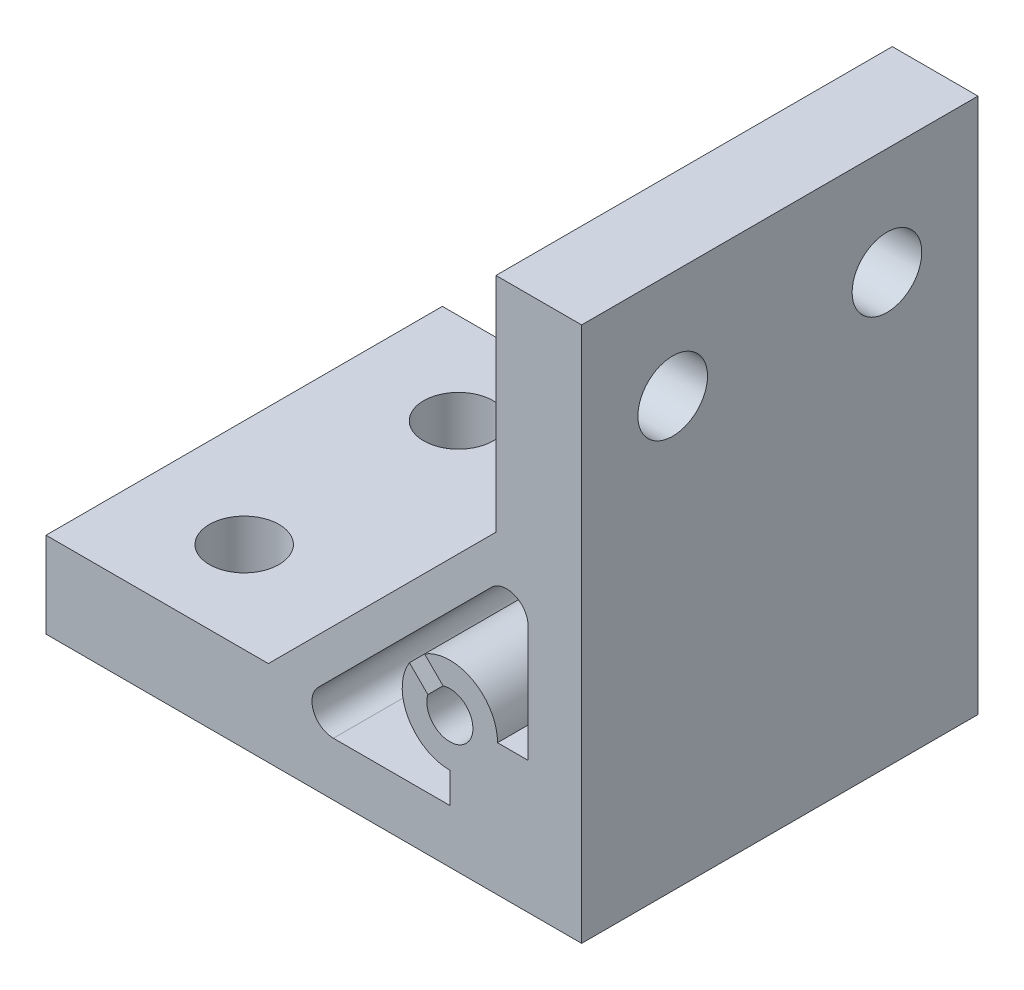
ISO-10303-21;
HEADER;
FILE_DESCRIPTION(('STEP AP214'),'2;1');
FILE_NAME('part.step','',(''),(''),'','','');
FILE_SCHEMA(('AUTOMOTIVE_DESIGN { 1 0 10303 214 1 1 1 1 }'));
ENDSEC;
DATA;
#1=APPLICATION_CONTEXT('core data for automotive mechanical design processes');
#2=APPLICATION_PROTOCOL_DEFINITION('international standard','automotive_design',2000,#1);
#3=PRODUCT_CONTEXT('',#1,'mechanical');
#4=PRODUCT('Part','Part','',(#3));
#5=PRODUCT_RELATED_PRODUCT_CATEGORY('part','',(#4));
#6=PRODUCT_DEFINITION_FORMATION('','',#4);
#7=PRODUCT_DEFINITION_CONTEXT('part definition',#1,'design');
#8=PRODUCT_DEFINITION('design','',#6,#7);
#9=PRODUCT_DEFINITION_SHAPE('','',#8);
#10=(LENGTH_UNIT() NAMED_UNIT(*) SI_UNIT(.MILLI.,.METRE.));
#11=(NAMED_UNIT(*) PLANE_ANGLE_UNIT() SI_UNIT($,.RADIAN.));
#12=(NAMED_UNIT(*) SI_UNIT($,.STERADIAN.) SOLID_ANGLE_UNIT());
#13=UNCERTAINTY_MEASURE_WITH_UNIT(LENGTH_MEASURE(1.E-05),#10,'distance_accuracy_value','');
#14=(GEOMETRIC_REPRESENTATION_CONTEXT(3) GLOBAL_UNCERTAINTY_ASSIGNED_CONTEXT((#13)) GLOBAL_UNIT_ASSIGNED_CONTEXT((#10,
#11,#12)) REPRESENTATION_CONTEXT('',''));
#15=CARTESIAN_POINT('',(0.,0.,0.));
#16=DIRECTION('',(0.,0.,1.));
#17=DIRECTION('',(1.,0.,0.));
#18=AXIS2_PLACEMENT_3D('',#15,#16,#17);
#19=CARTESIAN_POINT('',(50.,0.,18.5));
#20=DIRECTION('',(-1.,0.,0.));
#21=DIRECTION('',(0.,0.,1.));
#22=AXIS2_PLACEMENT_3D('',#19,#20,#21);
#23=PLANE('',#22);
#24=CARTESIAN_POINT('',(50.0000000000001,40.,-10.));
#25=DIRECTION('',(1.,0.,0.));
#26=DIRECTION('',(0.,0.,1.));
#27=AXIS2_PLACEMENT_3D('',#24,#25,#26);
#28=CIRCLE('',#27,3.25);
#29=CARTESIAN_POINT('',(50.0000000000001,40.,-6.75));
#30=VERTEX_POINT('',#29);
#31=EDGE_CURVE('E380',#30,#30,#28,.T.);
#32=ORIENTED_EDGE('',*,*,#31,.F.);
#33=EDGE_LOOP('',(#32));
#34=FACE_BOUND('',#33,.T.);
#35=DIRECTION('',(0.,1.,0.));
#36=VECTOR('',#35,1.);
#37=CARTESIAN_POINT('',(50.,0.,-18.5));
#38=LINE('',#37,#36);
#39=CARTESIAN_POINT('',(50.,0.,-18.5));
#40=VERTEX_POINT('',#39);
#41=CARTESIAN_POINT('',(50.,50.,-18.5));
#42=VERTEX_POINT('',#41);
#43=EDGE_CURVE('E283',#40,#42,#38,.T.);
#44=ORIENTED_EDGE('',*,*,#43,.T.);
#45=DIRECTION('',(0.,0.,-1.));
#46=VECTOR('',#45,1.);
#47=CARTESIAN_POINT('',(50.,50.,18.5));
#48=LINE('',#47,#46);
#49=CARTESIAN_POINT('',(50.,50.,18.5));
#50=VERTEX_POINT('',#49);
#51=EDGE_CURVE('E303',#50,#42,#48,.T.);
#52=ORIENTED_EDGE('',*,*,#51,.F.);
#53=DIRECTION('',(0.,1.,0.));
#54=VECTOR('',#53,1.);
#55=CARTESIAN_POINT('',(50.,0.,18.5));
#56=LINE('',#55,#54);
#57=CARTESIAN_POINT('',(50.,0.,18.5));
#58=VERTEX_POINT('',#57);
#59=EDGE_CURVE('E268',#58,#50,#56,.T.);
#60=ORIENTED_EDGE('',*,*,#59,.F.);
#61=DIRECTION('',(0.,0.,-1.));
#62=VECTOR('',#61,1.);
#63=CARTESIAN_POINT('',(50.,0.,18.5));
#64=LINE('',#63,#62);
#65=EDGE_CURVE('E43',#58,#40,#64,.T.);
#66=ORIENTED_EDGE('',*,*,#65,.T.);
#67=EDGE_LOOP('',(#44,#52,#60,#66));
#68=FACE_BOUND('',#67,.T.);
#69=CARTESIAN_POINT('',(50.0000000000001,40.,10.));
#70=DIRECTION('',(1.,0.,0.));
#71=DIRECTION('',(0.,0.,-1.));
#72=AXIS2_PLACEMENT_3D('',#69,#70,#71);
#73=CIRCLE('',#72,3.25);
#74=CARTESIAN_POINT('',(50.0000000000001,40.,6.75));
#75=VERTEX_POINT('',#74);
#76=EDGE_CURVE('E385',#75,#75,#73,.T.);
#77=ORIENTED_EDGE('',*,*,#76,.F.);
#78=EDGE_LOOP('',(#77));
#79=FACE_BOUND('',#78,.T.);
#80=ADVANCED_FACE('F35',(#34,#68,#79),#23,.F.);
#81=CARTESIAN_POINT('',(42.,29.2426406871192,18.5));
#82=DIRECTION('',(1.,0.,0.));
#83=DIRECTION('',(0.,0.,-1.));
#84=AXIS2_PLACEMENT_3D('',#81,#82,#83);
#85=PLANE('',#84);
#86=CARTESIAN_POINT('',(42.0000000000001,40.,-10.));
#87=DIRECTION('',(1.,0.,0.));
#88=DIRECTION('',(0.,0.,1.));
#89=AXIS2_PLACEMENT_3D('',#86,#87,#88);
#90=CIRCLE('',#89,3.25);
#91=CARTESIAN_POINT('',(42.0000000000001,40.,-6.75));
#92=VERTEX_POINT('',#91);
#93=EDGE_CURVE('E382',#92,#92,#90,.T.);
#94=ORIENTED_EDGE('',*,*,#93,.T.);
#95=EDGE_LOOP('',(#94));
#96=FACE_BOUND('',#95,.T.);
#97=DIRECTION('',(0.,-1.,0.));
#98=VECTOR('',#97,1.);
#99=CARTESIAN_POINT('',(42.,29.2426406871192,-18.5));
#100=LINE('',#99,#98);
#101=CARTESIAN_POINT('',(42.,50.,-18.5));
#102=VERTEX_POINT('',#101);
#103=CARTESIAN_POINT('',(42.,29.2426406871192,-18.5));
#104=VERTEX_POINT('',#103);
#105=EDGE_CURVE('E287',#102,#104,#100,.T.);
#106=ORIENTED_EDGE('',*,*,#105,.T.);
#107=DIRECTION('',(0.,0.,-1.));
#108=VECTOR('',#107,1.);
#109=CARTESIAN_POINT('',(42.,29.2426406871192,18.5));
#110=LINE('',#109,#108);
#111=CARTESIAN_POINT('',(42.,29.2426406871192,18.5));
#112=VERTEX_POINT('',#111);
#113=EDGE_CURVE('E297',#112,#104,#110,.T.);
#114=ORIENTED_EDGE('',*,*,#113,.F.);
#115=DIRECTION('',(0.,-1.,0.));
#116=VECTOR('',#115,1.);
#117=CARTESIAN_POINT('',(42.,29.2426406871192,18.5));
#118=LINE('',#117,#116);
#119=CARTESIAN_POINT('',(42.,50.,18.5));
#120=VERTEX_POINT('',#119);
#121=EDGE_CURVE('E272',#120,#112,#118,.T.);
#122=ORIENTED_EDGE('',*,*,#121,.F.);
#123=DIRECTION('',(0.,0.,-1.));
#124=VECTOR('',#123,1.);
#125=CARTESIAN_POINT('',(42.,50.,18.5));
#126=LINE('',#125,#124);
#127=EDGE_CURVE('E300',#120,#102,#126,.T.);
#128=ORIENTED_EDGE('',*,*,#127,.T.);
#129=EDGE_LOOP('',(#106,#114,#122,#128));
#130=FACE_BOUND('',#129,.T.);
#131=CARTESIAN_POINT('',(42.0000000000001,40.,10.));
#132=DIRECTION('',(1.,0.,0.));
#133=DIRECTION('',(0.,0.,-1.));
#134=AXIS2_PLACEMENT_3D('',#131,#132,#133);
#135=CIRCLE('',#134,3.25);
#136=CARTESIAN_POINT('',(42.0000000000001,40.,6.75));
#137=VERTEX_POINT('',#136);
#138=EDGE_CURVE('E388',#137,#137,#135,.T.);
#139=ORIENTED_EDGE('',*,*,#138,.T.);
#140=EDGE_LOOP('',(#139));
#141=FACE_BOUND('',#140,.T.);
#142=ADVANCED_FACE('F326',(#96,#130,#141),#85,.F.);
#143=CARTESIAN_POINT('',(0.,0.,18.5));
#144=DIRECTION('',(0.,0.,1.));
#145=DIRECTION('',(1.,0.,0.));
#146=AXIS2_PLACEMENT_3D('',#143,#144,#145);
#147=PLANE('',#146);
#148=DIRECTION('',(0.,-1.,0.));
#149=VECTOR('',#148,1.);
#150=CARTESIAN_POINT('',(0.,8.,18.5));
#151=LINE('',#150,#149);
#152=CARTESIAN_POINT('',(0.,8.,18.5));
#153=VERTEX_POINT('',#152);
#154=CARTESIAN_POINT('',(0.,0.,18.5));
#155=VERTEX_POINT('',#154);
#156=EDGE_CURVE('E262',#153,#155,#151,.T.);
#157=ORIENTED_EDGE('',*,*,#156,.T.);
#158=DIRECTION('',(1.,0.,0.));
#159=VECTOR('',#158,1.);
#160=CARTESIAN_POINT('',(0.,0.,18.5));
#161=LINE('',#160,#159);
#162=EDGE_CURVE('E265',#155,#58,#161,.T.);
#163=ORIENTED_EDGE('',*,*,#162,.T.);
#164=ORIENTED_EDGE('',*,*,#59,.T.);
#165=DIRECTION('',(-1.,0.,0.));
#166=VECTOR('',#165,1.);
#167=CARTESIAN_POINT('',(42.,50.,18.5));
#168=LINE('',#167,#166);
#169=EDGE_CURVE('E270',#50,#120,#168,.T.);
#170=ORIENTED_EDGE('',*,*,#169,.T.);
#171=ORIENTED_EDGE('',*,*,#121,.T.);
#172=DIRECTION('',(-0.707106781186546,-0.707106781186549,0.));
#173=VECTOR('',#172,1.);
#174=CARTESIAN_POINT('',(20.7573593128809,8.,18.5));
#175=LINE('',#174,#173);
#176=CARTESIAN_POINT('',(20.7573593128809,8.,18.5));
#177=VERTEX_POINT('',#176);
#178=EDGE_CURVE('E274',#112,#177,#175,.T.);
#179=ORIENTED_EDGE('',*,*,#178,.T.);
#180=DIRECTION('',(-1.,0.,0.));
#181=VECTOR('',#180,1.);
#182=CARTESIAN_POINT('',(0.,8.,18.5));
#183=LINE('',#182,#181);
#184=EDGE_CURVE('E276',#177,#153,#183,.T.);
#185=ORIENTED_EDGE('',*,*,#184,.T.);
#186=EDGE_LOOP('',(#157,#163,#164,#170,#171,#179,#185));
#187=FACE_BOUND('',#186,.T.);
#188=DIRECTION('',(0.707106781186549,-0.707106781186546,0.));
#189=VECTOR('',#188,1.);
#190=CARTESIAN_POINT('',(35.647066335444,12.9387201021829,18.5));
#191=LINE('',#190,#189);
#192=CARTESIAN_POINT('',(33.9267474297161,14.6590390079109,18.5));
#193=VERTEX_POINT('',#192);
#194=CARTESIAN_POINT('',(35.647066335444,12.9387201021829,18.5));
#195=VERTEX_POINT('',#194);
#196=EDGE_CURVE('E174',#193,#195,#191,.T.);
#197=ORIENTED_EDGE('',*,*,#196,.F.);
#198=CARTESIAN_POINT('',(37.7,12.3,18.5));
#199=DIRECTION('',(0.,0.,-1.));
#200=DIRECTION('',(1.,0.,0.));
#201=AXIS2_PLACEMENT_3D('',#198,#199,#200);
#202=CIRCLE('',#201,4.45);
#203=CARTESIAN_POINT('',(37.7,7.84999999999995,18.5));
#204=VERTEX_POINT('',#203);
#205=EDGE_CURVE('E166',#204,#193,#202,.T.);
#206=ORIENTED_EDGE('',*,*,#205,.F.);
#207=DIRECTION('',(0.,1.,0.));
#208=VECTOR('',#207,1.);
#209=CARTESIAN_POINT('',(37.7,5.,18.5));
#210=LINE('',#209,#208);
#211=CARTESIAN_POINT('',(37.7,5.,18.5));
#212=VERTEX_POINT('',#211);
#213=EDGE_CURVE('E209',#212,#204,#210,.T.);
#214=ORIENTED_EDGE('',*,*,#213,.F.);
#215=DIRECTION('',(1.,0.,0.));
#216=VECTOR('',#215,1.);
#217=CARTESIAN_POINT('',(26.828427124746,5.,18.5));
#218=LINE('',#217,#216);
#219=CARTESIAN_POINT('',(26.828427124746,4.99999999999993,18.5));
#220=VERTEX_POINT('',#219);
#221=EDGE_CURVE('E207',#220,#212,#218,.T.);
#222=ORIENTED_EDGE('',*,*,#221,.F.);
#223=CARTESIAN_POINT('',(26.8284271247464,7.00000000000011,18.5));
#224=DIRECTION('',(0.,0.,1.));
#225=DIRECTION('',(1.,0.,0.));
#226=AXIS2_PLACEMENT_3D('',#223,#224,#225);
#227=CIRCLE('',#226,2.00000000000019);
#228=CARTESIAN_POINT('',(25.4142135623729,8.41421356237311,18.5));
#229=VERTEX_POINT('',#228);
#230=EDGE_CURVE('E205',#229,#220,#227,.T.);
#231=ORIENTED_EDGE('',*,*,#230,.F.);
#232=DIRECTION('',(-0.70710678118655,-0.707106781186545,0.));
#233=VECTOR('',#232,1.);
#234=CARTESIAN_POINT('',(25.4142135623729,8.41421356237311,18.5));
#235=LINE('',#234,#233);
#236=CARTESIAN_POINT('',(41.585786437627,24.5857864376269,18.5));
#237=VERTEX_POINT('',#236);
#238=EDGE_CURVE('E203',#237,#229,#235,.T.);
#239=ORIENTED_EDGE('',*,*,#238,.F.);
#240=CARTESIAN_POINT('',(43.0000000000002,23.171572875254,18.5));
#241=DIRECTION('',(0.,0.,1.));
#242=DIRECTION('',(1.,0.,0.));
#243=AXIS2_PLACEMENT_3D('',#240,#241,#242);
#244=CIRCLE('',#243,1.99999999999993);
#245=CARTESIAN_POINT('',(45.,23.1715728752539,18.5));
#246=VERTEX_POINT('',#245);
#247=EDGE_CURVE('E201',#246,#237,#244,.T.);
#248=ORIENTED_EDGE('',*,*,#247,.F.);
#249=DIRECTION('',(0.,1.,0.));
#250=VECTOR('',#249,1.);
#251=CARTESIAN_POINT('',(45.,23.1715728752539,18.5));
#252=LINE('',#251,#250);
#253=CARTESIAN_POINT('',(45.,12.3,18.5));
#254=VERTEX_POINT('',#253);
#255=EDGE_CURVE('E199',#254,#246,#252,.T.);
#256=ORIENTED_EDGE('',*,*,#255,.F.);
#257=DIRECTION('',(1.,0.,0.));
#258=VECTOR('',#257,1.);
#259=CARTESIAN_POINT('',(42.15,12.3,18.5));
#260=LINE('',#259,#258);
#261=CARTESIAN_POINT('',(42.15,12.3,18.5));
#262=VERTEX_POINT('',#261);
#263=EDGE_CURVE('E197',#262,#254,#260,.T.);
#264=ORIENTED_EDGE('',*,*,#263,.F.);
#265=CARTESIAN_POINT('',(37.7,12.3,18.5));
#266=DIRECTION('',(0.,0.,-1.));
#267=DIRECTION('',(1.,0.,0.));
#268=AXIS2_PLACEMENT_3D('',#265,#266,#267);
#269=CIRCLE('',#268,4.45);
#270=CARTESIAN_POINT('',(35.3409609920885,16.0732525702836,18.5));
#271=VERTEX_POINT('',#270);
#272=EDGE_CURVE('E195',#271,#262,#269,.T.);
#273=ORIENTED_EDGE('',*,*,#272,.F.);
#274=DIRECTION('',(-0.707106781186684,0.707106781186411,0.));
#275=VECTOR('',#274,1.);
#276=CARTESIAN_POINT('',(37.0612798978168,14.3529336645559,18.5));
#277=LINE('',#276,#275);
#278=CARTESIAN_POINT('',(37.0612798978168,14.3529336645559,18.5));
#279=VERTEX_POINT('',#278);
#280=EDGE_CURVE('E190',#279,#271,#277,.T.);
#281=ORIENTED_EDGE('',*,*,#280,.F.);
#282=CARTESIAN_POINT('',(37.7,12.3,18.5));
#283=DIRECTION('',(0.,0.,1.));
#284=DIRECTION('',(1.,0.,0.));
#285=AXIS2_PLACEMENT_3D('',#282,#283,#284);
#286=CIRCLE('',#285,2.15);
#287=EDGE_CURVE('E188',#195,#279,#286,.T.);
#288=ORIENTED_EDGE('',*,*,#287,.F.);
#289=EDGE_LOOP('',(#197,#206,#214,#222,#231,#239,#248,#256,#264,#273,#281,#288));
#290=FACE_BOUND('',#289,.T.);
#291=ADVANCED_FACE('F186',(#187,#290),#147,.T.);
#292=CARTESIAN_POINT('',(0.,0.,-18.5));
#293=DIRECTION('',(0.,0.,1.));
#294=DIRECTION('',(1.,0.,0.));
#295=AXIS2_PLACEMENT_3D('',#292,#293,#294);
#296=PLANE('',#295);
#297=DIRECTION('',(0.,-1.,0.));
#298=VECTOR('',#297,1.);
#299=CARTESIAN_POINT('',(0.,8.,-18.5));
#300=LINE('',#299,#298);
#301=CARTESIAN_POINT('',(0.,8.,-18.5));
#302=VERTEX_POINT('',#301);
#303=CARTESIAN_POINT('',(0.,0.,-18.5));
#304=VERTEX_POINT('',#303);
#305=EDGE_CURVE('E182',#302,#304,#300,.T.);
#306=ORIENTED_EDGE('',*,*,#305,.F.);
#307=DIRECTION('',(-1.,0.,0.));
#308=VECTOR('',#307,1.);
#309=CARTESIAN_POINT('',(0.,8.,-18.5));
#310=LINE('',#309,#308);
#311=CARTESIAN_POINT('',(20.7573593128809,8.,-18.5));
#312=VERTEX_POINT('',#311);
#313=EDGE_CURVE('E266',#312,#302,#310,.T.);
#314=ORIENTED_EDGE('',*,*,#313,.F.);
#315=DIRECTION('',(-0.707106781186546,-0.707106781186549,0.));
#316=VECTOR('',#315,1.);
#317=CARTESIAN_POINT('',(20.7573593128809,8.,-18.5));
#318=LINE('',#317,#316);
#319=EDGE_CURVE('E289',#104,#312,#318,.T.);
#320=ORIENTED_EDGE('',*,*,#319,.F.);
#321=ORIENTED_EDGE('',*,*,#105,.F.);
#322=DIRECTION('',(-1.,0.,0.));
#323=VECTOR('',#322,1.);
#324=CARTESIAN_POINT('',(42.,50.,-18.5));
#325=LINE('',#324,#323);
#326=EDGE_CURVE('E285',#42,#102,#325,.T.);
#327=ORIENTED_EDGE('',*,*,#326,.F.);
#328=ORIENTED_EDGE('',*,*,#43,.F.);
#329=DIRECTION('',(1.,0.,0.));
#330=VECTOR('',#329,1.);
#331=CARTESIAN_POINT('',(0.,0.,-18.5));
#332=LINE('',#331,#330);
#333=EDGE_CURVE('E281',#304,#40,#332,.T.);
#334=ORIENTED_EDGE('',*,*,#333,.F.);
#335=EDGE_LOOP('',(#306,#314,#320,#321,#327,#328,#334));
#336=FACE_BOUND('',#335,.T.);
#337=CARTESIAN_POINT('',(37.7,12.3,-18.5));
#338=DIRECTION('',(0.,0.,-1.));
#339=DIRECTION('',(1.,0.,0.));
#340=AXIS2_PLACEMENT_3D('',#337,#338,#339);
#341=CIRCLE('',#340,4.45);
#342=CARTESIAN_POINT('',(37.7,7.84999999999995,-18.5));
#343=VERTEX_POINT('',#342);
#344=CARTESIAN_POINT('',(33.9267474297161,14.6590390079109,-18.5));
#345=VERTEX_POINT('',#344);
#346=EDGE_CURVE('E58',#343,#345,#341,.T.);
#347=ORIENTED_EDGE('',*,*,#346,.T.);
#348=DIRECTION('',(0.707106781186549,-0.707106781186546,0.));
#349=VECTOR('',#348,1.);
#350=CARTESIAN_POINT('',(35.647066335444,12.9387201021829,-18.5));
#351=LINE('',#350,#349);
#352=CARTESIAN_POINT('',(35.647066335444,12.9387201021829,-18.5));
#353=VERTEX_POINT('',#352);
#354=EDGE_CURVE('E181',#345,#353,#351,.T.);
#355=ORIENTED_EDGE('',*,*,#354,.T.);
#356=CARTESIAN_POINT('',(37.7,12.3,-18.5));
#357=DIRECTION('',(0.,0.,1.));
#358=DIRECTION('',(1.,0.,0.));
#359=AXIS2_PLACEMENT_3D('',#356,#357,#358);
#360=CIRCLE('',#359,2.15);
#361=CARTESIAN_POINT('',(37.0612798978168,14.3529336645559,-18.5));
#362=VERTEX_POINT('',#361);
#363=EDGE_CURVE('E214',#353,#362,#360,.T.);
#364=ORIENTED_EDGE('',*,*,#363,.T.);
#365=DIRECTION('',(-0.707106781186684,0.707106781186411,0.));
#366=VECTOR('',#365,1.);
#367=CARTESIAN_POINT('',(37.0612798978168,14.3529336645559,-18.5));
#368=LINE('',#367,#366);
#369=CARTESIAN_POINT('',(35.3409609920885,16.0732525702836,-18.5));
#370=VERTEX_POINT('',#369);
#371=EDGE_CURVE('E217',#362,#370,#368,.T.);
#372=ORIENTED_EDGE('',*,*,#371,.T.);
#373=CARTESIAN_POINT('',(37.7,12.3,-18.5));
#374=DIRECTION('',(0.,0.,-1.));
#375=DIRECTION('',(1.,0.,0.));
#376=AXIS2_PLACEMENT_3D('',#373,#374,#375);
#377=CIRCLE('',#376,4.45);
#378=CARTESIAN_POINT('',(42.15,12.3,-18.5));
#379=VERTEX_POINT('',#378);
#380=EDGE_CURVE('E220',#370,#379,#377,.T.);
#381=ORIENTED_EDGE('',*,*,#380,.T.);
#382=DIRECTION('',(1.,0.,0.));
#383=VECTOR('',#382,1.);
#384=CARTESIAN_POINT('',(42.15,12.3,-18.5));
#385=LINE('',#384,#383);
#386=CARTESIAN_POINT('',(45.,12.3,-18.5));
#387=VERTEX_POINT('',#386);
#388=EDGE_CURVE('E223',#379,#387,#385,.T.);
#389=ORIENTED_EDGE('',*,*,#388,.T.);
#390=DIRECTION('',(0.,1.,0.));
#391=VECTOR('',#390,1.);
#392=CARTESIAN_POINT('',(45.,23.1715728752539,-18.5));
#393=LINE('',#392,#391);
#394=CARTESIAN_POINT('',(45.,23.1715728752539,-18.5));
#395=VERTEX_POINT('',#394);
#396=EDGE_CURVE('E226',#387,#395,#393,.T.);
#397=ORIENTED_EDGE('',*,*,#396,.T.);
#398=CARTESIAN_POINT('',(43.0000000000002,23.171572875254,-18.5));
#399=DIRECTION('',(0.,0.,1.));
#400=DIRECTION('',(1.,0.,0.));
#401=AXIS2_PLACEMENT_3D('',#398,#399,#400);
#402=CIRCLE('',#401,1.99999999999993);
#403=CARTESIAN_POINT('',(41.585786437627,24.5857864376269,-18.5));
#404=VERTEX_POINT('',#403);
#405=EDGE_CURVE('E229',#395,#404,#402,.T.);
#406=ORIENTED_EDGE('',*,*,#405,.T.);
#407=DIRECTION('',(-0.70710678118655,-0.707106781186545,0.));
#408=VECTOR('',#407,1.);
#409=CARTESIAN_POINT('',(25.4142135623729,8.41421356237311,-18.5));
#410=LINE('',#409,#408);
#411=CARTESIAN_POINT('',(25.4142135623729,8.41421356237311,-18.5));
#412=VERTEX_POINT('',#411);
#413=EDGE_CURVE('E232',#404,#412,#410,.T.);
#414=ORIENTED_EDGE('',*,*,#413,.T.);
#415=CARTESIAN_POINT('',(26.8284271247464,7.00000000000011,-18.5));
#416=DIRECTION('',(0.,0.,1.));
#417=DIRECTION('',(1.,0.,0.));
#418=AXIS2_PLACEMENT_3D('',#415,#416,#417);
#419=CIRCLE('',#418,2.00000000000019);
#420=CARTESIAN_POINT('',(26.828427124746,4.99999999999993,-18.5));
#421=VERTEX_POINT('',#420);
#422=EDGE_CURVE('E235',#412,#421,#419,.T.);
#423=ORIENTED_EDGE('',*,*,#422,.T.);
#424=DIRECTION('',(1.,0.,0.));
#425=VECTOR('',#424,1.);
#426=CARTESIAN_POINT('',(26.828427124746,5.,-18.5));
#427=LINE('',#426,#425);
#428=CARTESIAN_POINT('',(37.7,5.,-18.5));
#429=VERTEX_POINT('',#428);
#430=EDGE_CURVE('E238',#421,#429,#427,.T.);
#431=ORIENTED_EDGE('',*,*,#430,.T.);
#432=DIRECTION('',(0.,1.,0.));
#433=VECTOR('',#432,1.);
#434=CARTESIAN_POINT('',(37.7,5.,-18.5));
#435=LINE('',#434,#433);
#436=EDGE_CURVE('E175',#429,#343,#435,.T.);
#437=ORIENTED_EDGE('',*,*,#436,.T.);
#438=EDGE_LOOP('',(#347,#355,#364,#372,#381,#389,#397,#406,#414,#423,#431,#437));
#439=FACE_BOUND('',#438,.T.);
#440=ADVANCED_FACE('F316',(#336,#439),#296,.F.);
#441=CARTESIAN_POINT('',(0.,8.,18.5));
#442=DIRECTION('',(1.,0.,0.));
#443=DIRECTION('',(0.,0.,-1.));
#444=AXIS2_PLACEMENT_3D('',#441,#442,#443);
#445=PLANE('',#444);
#446=ORIENTED_EDGE('',*,*,#305,.T.);
#447=DIRECTION('',(0.,0.,-1.));
#448=VECTOR('',#447,1.);
#449=CARTESIAN_POINT('',(0.,0.,18.5));
#450=LINE('',#449,#448);
#451=EDGE_CURVE('E11',#155,#304,#450,.T.);
#452=ORIENTED_EDGE('',*,*,#451,.F.);
#453=ORIENTED_EDGE('',*,*,#156,.F.);
#454=DIRECTION('',(0.,0.,-1.));
#455=VECTOR('',#454,1.);
#456=CARTESIAN_POINT('',(0.,8.,18.5));
#457=LINE('',#456,#455);
#458=EDGE_CURVE('E278',#153,#302,#457,.T.);
#459=ORIENTED_EDGE('',*,*,#458,.T.);
#460=EDGE_LOOP('',(#446,#452,#453,#459));
#461=FACE_BOUND('',#460,.T.);
#462=ADVANCED_FACE('F37',(#461),#445,.F.);
#463=CARTESIAN_POINT('',(0.,0.,18.5));
#464=DIRECTION('',(0.,1.,0.));
#465=DIRECTION('',(0.,0.,1.));
#466=AXIS2_PLACEMENT_3D('',#463,#464,#465);
#467=PLANE('',#466);
#468=CARTESIAN_POINT('',(10.,0.,10.));
#469=DIRECTION('',(0.,1.,0.));
#470=DIRECTION('',(0.,0.,-1.));
#471=AXIS2_PLACEMENT_3D('',#468,#469,#470);
#472=CIRCLE('',#471,3.25);
#473=CARTESIAN_POINT('',(10.,0.,6.75));
#474=VERTEX_POINT('',#473);
#475=EDGE_CURVE('E369',#474,#474,#472,.T.);
#476=ORIENTED_EDGE('',*,*,#475,.T.);
#477=EDGE_LOOP('',(#476));
#478=FACE_BOUND('',#477,.T.);
#479=CARTESIAN_POINT('',(10.,0.,-10.));
#480=DIRECTION('',(0.,1.,0.));
#481=DIRECTION('',(0.,0.,1.));
#482=AXIS2_PLACEMENT_3D('',#479,#480,#481);
#483=CIRCLE('',#482,3.25);
#484=CARTESIAN_POINT('',(10.,0.,-6.75));
#485=VERTEX_POINT('',#484);
#486=EDGE_CURVE('E212',#485,#485,#483,.T.);
#487=ORIENTED_EDGE('',*,*,#486,.T.);
#488=EDGE_LOOP('',(#487));
#489=FACE_BOUND('',#488,.T.);
#490=ORIENTED_EDGE('',*,*,#333,.T.);
#491=ORIENTED_EDGE('',*,*,#65,.F.);
#492=ORIENTED_EDGE('',*,*,#162,.F.);
#493=ORIENTED_EDGE('',*,*,#451,.T.);
#494=EDGE_LOOP('',(#490,#491,#492,#493));
#495=FACE_BOUND('',#494,.T.);
#496=ADVANCED_FACE('F334',(#478,#489,#495),#467,.F.);
#497=CARTESIAN_POINT('',(42.,50.,18.5));
#498=DIRECTION('',(0.,-1.,0.));
#499=DIRECTION('',(0.,0.,-1.));
#500=AXIS2_PLACEMENT_3D('',#497,#498,#499);
#501=PLANE('',#500);
#502=ORIENTED_EDGE('',*,*,#326,.T.);
#503=ORIENTED_EDGE('',*,*,#127,.F.);
#504=ORIENTED_EDGE('',*,*,#169,.F.);
#505=ORIENTED_EDGE('',*,*,#51,.T.);
#506=EDGE_LOOP('',(#502,#503,#504,#505));
#507=FACE_BOUND('',#506,.T.);
#508=ADVANCED_FACE('F322',(#507),#501,.F.);
#509=CARTESIAN_POINT('',(20.7573593128809,8.,18.5));
#510=DIRECTION('',(0.707106781186549,-0.707106781186546,0.));
#511=DIRECTION('',(0.707106781186546,0.707106781186549,0.));
#512=AXIS2_PLACEMENT_3D('',#509,#510,#511);
#513=PLANE('',#512);
#514=ORIENTED_EDGE('',*,*,#319,.T.);
#515=DIRECTION('',(0.,0.,-1.));
#516=VECTOR('',#515,1.);
#517=CARTESIAN_POINT('',(20.7573593128809,8.,18.5));
#518=LINE('',#517,#516);
#519=EDGE_CURVE('E294',#177,#312,#518,.T.);
#520=ORIENTED_EDGE('',*,*,#519,.F.);
#521=ORIENTED_EDGE('',*,*,#178,.F.);
#522=ORIENTED_EDGE('',*,*,#113,.T.);
#523=EDGE_LOOP('',(#514,#520,#521,#522));
#524=FACE_BOUND('',#523,.T.);
#525=ADVANCED_FACE('F342',(#524),#513,.F.);
#526=CARTESIAN_POINT('',(0.,8.,18.5));
#527=DIRECTION('',(0.,-1.,0.));
#528=DIRECTION('',(0.,0.,-1.));
#529=AXIS2_PLACEMENT_3D('',#526,#527,#528);
#530=PLANE('',#529);
#531=CARTESIAN_POINT('',(10.,8.,10.));
#532=DIRECTION('',(0.,1.,0.));
#533=DIRECTION('',(0.,0.,-1.));
#534=AXIS2_PLACEMENT_3D('',#531,#532,#533);
#535=CIRCLE('',#534,3.25);
#536=CARTESIAN_POINT('',(10.,8.,6.75));
#537=VERTEX_POINT('',#536);
#538=EDGE_CURVE('E377',#537,#537,#535,.T.);
#539=ORIENTED_EDGE('',*,*,#538,.F.);
#540=EDGE_LOOP('',(#539));
#541=FACE_BOUND('',#540,.T.);
#542=CARTESIAN_POINT('',(10.,8.,-10.));
#543=DIRECTION('',(0.,1.,0.));
#544=DIRECTION('',(0.,0.,1.));
#545=AXIS2_PLACEMENT_3D('',#542,#543,#544);
#546=CIRCLE('',#545,3.25);
#547=CARTESIAN_POINT('',(10.,8.,-6.75));
#548=VERTEX_POINT('',#547);
#549=EDGE_CURVE('E373',#548,#548,#546,.T.);
#550=ORIENTED_EDGE('',*,*,#549,.F.);
#551=EDGE_LOOP('',(#550));
#552=FACE_BOUND('',#551,.T.);
#553=ORIENTED_EDGE('',*,*,#313,.T.);
#554=ORIENTED_EDGE('',*,*,#458,.F.);
#555=ORIENTED_EDGE('',*,*,#184,.F.);
#556=ORIENTED_EDGE('',*,*,#519,.T.);
#557=EDGE_LOOP('',(#553,#554,#555,#556));
#558=FACE_BOUND('',#557,.T.);
#559=ADVANCED_FACE('F339',(#541,#552,#558),#530,.F.);
#560=CARTESIAN_POINT('',(37.7,12.3,18.5));
#561=DIRECTION('',(0.,0.,-1.));
#562=DIRECTION('',(-1.,0.,0.));
#563=AXIS2_PLACEMENT_3D('',#560,#561,#562);
#564=CYLINDRICAL_SURFACE('',#563,4.45);
#565=ORIENTED_EDGE('',*,*,#346,.F.);
#566=DIRECTION('',(0.,0.,-1.));
#567=VECTOR('',#566,1.);
#568=CARTESIAN_POINT('',(37.7,7.84999999999995,18.5));
#569=LINE('',#568,#567);
#570=EDGE_CURVE('E170',#204,#343,#569,.T.);
#571=ORIENTED_EDGE('',*,*,#570,.F.);
#572=ORIENTED_EDGE('',*,*,#205,.T.);
#573=DIRECTION('',(0.,0.,-1.));
#574=VECTOR('',#573,1.);
#575=CARTESIAN_POINT('',(33.9267474297161,14.6590390079109,18.5));
#576=LINE('',#575,#574);
#577=EDGE_CURVE('E169',#193,#345,#576,.T.);
#578=ORIENTED_EDGE('',*,*,#577,.T.);
#579=EDGE_LOOP('',(#565,#571,#572,#578));
#580=FACE_BOUND('',#579,.T.);
#581=ADVANCED_FACE('F168',(#580),#564,.T.);
#582=CARTESIAN_POINT('',(35.647066335444,12.9387201021829,18.5));
#583=DIRECTION('',(0.707106781186546,0.707106781186549,0.));
#584=DIRECTION('',(-0.707106781186549,0.707106781186546,0.));
#585=AXIS2_PLACEMENT_3D('',#582,#583,#584);
#586=PLANE('',#585);
#587=ORIENTED_EDGE('',*,*,#354,.F.);
#588=ORIENTED_EDGE('',*,*,#577,.F.);
#589=ORIENTED_EDGE('',*,*,#196,.T.);
#590=DIRECTION('',(0.,0.,-1.));
#591=VECTOR('',#590,1.);
#592=CARTESIAN_POINT('',(35.647066335444,12.9387201021829,18.5));
#593=LINE('',#592,#591);
#594=EDGE_CURVE('E183',#195,#353,#593,.T.);
#595=ORIENTED_EDGE('',*,*,#594,.T.);
#596=EDGE_LOOP('',(#587,#588,#589,#595));
#597=FACE_BOUND('',#596,.T.);
#598=ADVANCED_FACE('F178',(#597),#586,.T.);
#599=CARTESIAN_POINT('',(37.7,12.3,18.5));
#600=DIRECTION('',(0.,0.,-1.));
#601=DIRECTION('',(-1.,0.,0.));
#602=AXIS2_PLACEMENT_3D('',#599,#600,#601);
#603=CYLINDRICAL_SURFACE('',#602,2.15);
#604=ORIENTED_EDGE('',*,*,#363,.F.);
#605=ORIENTED_EDGE('',*,*,#594,.F.);
#606=ORIENTED_EDGE('',*,*,#287,.T.);
#607=DIRECTION('',(0.,0.,-1.));
#608=VECTOR('',#607,1.);
#609=CARTESIAN_POINT('',(37.0612798978168,14.3529336645559,18.5));
#610=LINE('',#609,#608);
#611=EDGE_CURVE('E259',#279,#362,#610,.T.);
#612=ORIENTED_EDGE('',*,*,#611,.T.);
#613=EDGE_LOOP('',(#604,#605,#606,#612));
#614=FACE_BOUND('',#613,.T.);
#615=ADVANCED_FACE('F447',(#614),#603,.F.);
#616=CARTESIAN_POINT('',(37.0612798978168,14.3529336645559,18.5));
#617=DIRECTION('',(-0.707106781186411,-0.707106781186684,0.));
#618=DIRECTION('',(0.707106781186684,-0.707106781186411,0.));
#619=AXIS2_PLACEMENT_3D('',#616,#617,#618);
#620=PLANE('',#619);
#621=ORIENTED_EDGE('',*,*,#371,.F.);
#622=ORIENTED_EDGE('',*,*,#611,.F.);
#623=ORIENTED_EDGE('',*,*,#280,.T.);
#624=DIRECTION('',(0.,0.,-1.));
#625=VECTOR('',#624,1.);
#626=CARTESIAN_POINT('',(35.3409609920885,16.0732525702836,18.5));
#627=LINE('',#626,#625);
#628=EDGE_CURVE('E257',#271,#370,#627,.T.);
#629=ORIENTED_EDGE('',*,*,#628,.T.);
#630=EDGE_LOOP('',(#621,#622,#623,#629));
#631=FACE_BOUND('',#630,.T.);
#632=ADVANCED_FACE('F443',(#631),#620,.T.);
#633=CARTESIAN_POINT('',(37.7,12.3,18.5));
#634=DIRECTION('',(0.,0.,-1.));
#635=DIRECTION('',(-1.,0.,0.));
#636=AXIS2_PLACEMENT_3D('',#633,#634,#635);
#637=CYLINDRICAL_SURFACE('',#636,4.45);
#638=ORIENTED_EDGE('',*,*,#380,.F.);
#639=ORIENTED_EDGE('',*,*,#628,.F.);
#640=ORIENTED_EDGE('',*,*,#272,.T.);
#641=DIRECTION('',(0.,0.,-1.));
#642=VECTOR('',#641,1.);
#643=CARTESIAN_POINT('',(42.15,12.3,18.5));
#644=LINE('',#643,#642);
#645=EDGE_CURVE('E255',#262,#379,#644,.T.);
#646=ORIENTED_EDGE('',*,*,#645,.T.);
#647=EDGE_LOOP('',(#638,#639,#640,#646));
#648=FACE_BOUND('',#647,.T.);
#649=ADVANCED_FACE('F439',(#648),#637,.T.);
#650=CARTESIAN_POINT('',(42.15,12.3,18.5));
#651=DIRECTION('',(0.,1.,0.));
#652=DIRECTION('',(0.,0.,1.));
#653=AXIS2_PLACEMENT_3D('',#650,#651,#652);
#654=PLANE('',#653);
#655=ORIENTED_EDGE('',*,*,#388,.F.);
#656=ORIENTED_EDGE('',*,*,#645,.F.);
#657=ORIENTED_EDGE('',*,*,#263,.T.);
#658=DIRECTION('',(0.,0.,-1.));
#659=VECTOR('',#658,1.);
#660=CARTESIAN_POINT('',(45.,12.3,18.5));
#661=LINE('',#660,#659);
#662=EDGE_CURVE('E253',#254,#387,#661,.T.);
#663=ORIENTED_EDGE('',*,*,#662,.T.);
#664=EDGE_LOOP('',(#655,#656,#657,#663));
#665=FACE_BOUND('',#664,.T.);
#666=ADVANCED_FACE('F435',(#665),#654,.T.);
#667=CARTESIAN_POINT('',(45.,23.1715728752539,18.5));
#668=DIRECTION('',(-1.,0.,0.));
#669=DIRECTION('',(0.,0.,1.));
#670=AXIS2_PLACEMENT_3D('',#667,#668,#669);
#671=PLANE('',#670);
#672=ORIENTED_EDGE('',*,*,#396,.F.);
#673=ORIENTED_EDGE('',*,*,#662,.F.);
#674=ORIENTED_EDGE('',*,*,#255,.T.);
#675=DIRECTION('',(0.,0.,-1.));
#676=VECTOR('',#675,1.);
#677=CARTESIAN_POINT('',(45.,23.1715728752539,18.5));
#678=LINE('',#677,#676);
#679=EDGE_CURVE('E251',#246,#395,#678,.T.);
#680=ORIENTED_EDGE('',*,*,#679,.T.);
#681=EDGE_LOOP('',(#672,#673,#674,#680));
#682=FACE_BOUND('',#681,.T.);
#683=ADVANCED_FACE('F431',(#682),#671,.T.);
#684=CARTESIAN_POINT('',(43.0000000000002,23.171572875254,18.5));
#685=DIRECTION('',(0.,0.,-1.));
#686=DIRECTION('',(-1.,0.,0.));
#687=AXIS2_PLACEMENT_3D('',#684,#685,#686);
#688=CYLINDRICAL_SURFACE('',#687,1.99999999999993);
#689=ORIENTED_EDGE('',*,*,#405,.F.);
#690=ORIENTED_EDGE('',*,*,#679,.F.);
#691=ORIENTED_EDGE('',*,*,#247,.T.);
#692=DIRECTION('',(0.,0.,-1.));
#693=VECTOR('',#692,1.);
#694=CARTESIAN_POINT('',(41.585786437627,24.5857864376269,18.5));
#695=LINE('',#694,#693);
#696=EDGE_CURVE('E249',#237,#404,#695,.T.);
#697=ORIENTED_EDGE('',*,*,#696,.T.);
#698=EDGE_LOOP('',(#689,#690,#691,#697));
#699=FACE_BOUND('',#698,.T.);
#700=ADVANCED_FACE('F427',(#699),#688,.F.);
#701=CARTESIAN_POINT('',(25.4142135623729,8.41421356237311,18.5));
#702=DIRECTION('',(0.707106781186545,-0.70710678118655,0.));
#703=DIRECTION('',(0.70710678118655,0.707106781186545,0.));
#704=AXIS2_PLACEMENT_3D('',#701,#702,#703);
#705=PLANE('',#704);
#706=ORIENTED_EDGE('',*,*,#413,.F.);
#707=ORIENTED_EDGE('',*,*,#696,.F.);
#708=ORIENTED_EDGE('',*,*,#238,.T.);
#709=DIRECTION('',(0.,0.,-1.));
#710=VECTOR('',#709,1.);
#711=CARTESIAN_POINT('',(25.4142135623729,8.41421356237311,18.5));
#712=LINE('',#711,#710);
#713=EDGE_CURVE('E247',#229,#412,#712,.T.);
#714=ORIENTED_EDGE('',*,*,#713,.T.);
#715=EDGE_LOOP('',(#706,#707,#708,#714));
#716=FACE_BOUND('',#715,.T.);
#717=ADVANCED_FACE('F423',(#716),#705,.T.);
#718=CARTESIAN_POINT('',(26.8284271247464,7.00000000000011,18.5));
#719=DIRECTION('',(0.,0.,-1.));
#720=DIRECTION('',(-1.,0.,0.));
#721=AXIS2_PLACEMENT_3D('',#718,#719,#720);
#722=CYLINDRICAL_SURFACE('',#721,2.00000000000019);
#723=ORIENTED_EDGE('',*,*,#422,.F.);
#724=ORIENTED_EDGE('',*,*,#713,.F.);
#725=ORIENTED_EDGE('',*,*,#230,.T.);
#726=DIRECTION('',(0.,0.,-1.));
#727=VECTOR('',#726,1.);
#728=CARTESIAN_POINT('',(26.828427124746,4.99999999999993,18.5));
#729=LINE('',#728,#727);
#730=EDGE_CURVE('E245',#220,#421,#729,.T.);
#731=ORIENTED_EDGE('',*,*,#730,.T.);
#732=EDGE_LOOP('',(#723,#724,#725,#731));
#733=FACE_BOUND('',#732,.T.);
#734=ADVANCED_FACE('F419',(#733),#722,.F.);
#735=CARTESIAN_POINT('',(26.828427124746,5.,18.5));
#736=DIRECTION('',(0.,1.,0.));
#737=DIRECTION('',(0.,0.,1.));
#738=AXIS2_PLACEMENT_3D('',#735,#736,#737);
#739=PLANE('',#738);
#740=ORIENTED_EDGE('',*,*,#430,.F.);
#741=ORIENTED_EDGE('',*,*,#730,.F.);
#742=ORIENTED_EDGE('',*,*,#221,.T.);
#743=DIRECTION('',(0.,0.,-1.));
#744=VECTOR('',#743,1.);
#745=CARTESIAN_POINT('',(37.7,5.,18.5));
#746=LINE('',#745,#744);
#747=EDGE_CURVE('E50',#212,#429,#746,.T.);
#748=ORIENTED_EDGE('',*,*,#747,.T.);
#749=EDGE_LOOP('',(#740,#741,#742,#748));
#750=FACE_BOUND('',#749,.T.);
#751=ADVANCED_FACE('F416',(#750),#739,.T.);
#752=CARTESIAN_POINT('',(37.7,5.,18.5));
#753=DIRECTION('',(-1.,0.,0.));
#754=DIRECTION('',(0.,0.,1.));
#755=AXIS2_PLACEMENT_3D('',#752,#753,#754);
#756=PLANE('',#755);
#757=ORIENTED_EDGE('',*,*,#436,.F.);
#758=ORIENTED_EDGE('',*,*,#747,.F.);
#759=ORIENTED_EDGE('',*,*,#213,.T.);
#760=ORIENTED_EDGE('',*,*,#570,.T.);
#761=EDGE_LOOP('',(#757,#758,#759,#760));
#762=FACE_BOUND('',#761,.T.);
#763=ADVANCED_FACE('F413',(#762),#756,.T.);
#764=CARTESIAN_POINT('',(10.,0.,-10.));
#765=DIRECTION('',(0.,1.,0.));
#766=DIRECTION('',(0.,0.,1.));
#767=AXIS2_PLACEMENT_3D('',#764,#765,#766);
#768=CYLINDRICAL_SURFACE('',#767,3.25);
#769=ORIENTED_EDGE('',*,*,#486,.F.);
#770=EDGE_LOOP('',(#769));
#771=FACE_BOUND('',#770,.T.);
#772=ORIENTED_EDGE('',*,*,#549,.T.);
#773=EDGE_LOOP('',(#772));
#774=FACE_BOUND('',#773,.T.);
#775=ADVANCED_FACE('F409',(#771,#774),#768,.F.);
#776=CARTESIAN_POINT('',(10.,0.,10.));
#777=DIRECTION('',(0.,1.,0.));
#778=DIRECTION('',(0.,0.,1.));
#779=AXIS2_PLACEMENT_3D('',#776,#777,#778);
#780=CYLINDRICAL_SURFACE('',#779,3.25);
#781=ORIENTED_EDGE('',*,*,#475,.F.);
#782=EDGE_LOOP('',(#781));
#783=FACE_BOUND('',#782,.T.);
#784=ORIENTED_EDGE('',*,*,#538,.T.);
#785=EDGE_LOOP('',(#784));
#786=FACE_BOUND('',#785,.T.);
#787=ADVANCED_FACE('F403',(#783,#786),#780,.F.);
#788=CARTESIAN_POINT('',(50.0000000000001,40.,-10.));
#789=DIRECTION('',(-1.,0.,0.));
#790=DIRECTION('',(0.,-1.,0.));
#791=AXIS2_PLACEMENT_3D('',#788,#789,#790);
#792=CYLINDRICAL_SURFACE('',#791,3.25);
#793=ORIENTED_EDGE('',*,*,#31,.T.);
#794=EDGE_LOOP('',(#793));
#795=FACE_BOUND('',#794,.T.);
#796=ORIENTED_EDGE('',*,*,#93,.F.);
#797=EDGE_LOOP('',(#796));
#798=FACE_BOUND('',#797,.T.);
#799=ADVANCED_FACE('F397',(#795,#798),#792,.F.);
#800=CARTESIAN_POINT('',(50.0000000000001,40.,10.));
#801=DIRECTION('',(-1.,0.,0.));
#802=DIRECTION('',(0.,-1.,0.));
#803=AXIS2_PLACEMENT_3D('',#800,#801,#802);
#804=CYLINDRICAL_SURFACE('',#803,3.25);
#805=ORIENTED_EDGE('',*,*,#76,.T.);
#806=EDGE_LOOP('',(#805));
#807=FACE_BOUND('',#806,.T.);
#808=ORIENTED_EDGE('',*,*,#138,.F.);
#809=EDGE_LOOP('',(#808));
#810=FACE_BOUND('',#809,.T.);
#811=ADVANCED_FACE('F394',(#807,#810),#804,.F.);
#812=CLOSED_SHELL('',(#80,#142,#291,#440,#462,#496,#508,#525,#559,#581,#598,#615,#632,#649,#666,
#683,#700,#717,#734,#751,#763,#775,#787,#799,#811));
#813=MANIFOLD_SOLID_BREP('B2',#812);
#814=ADVANCED_BREP_SHAPE_REPRESENTATION('',(#18,#813),#14);
#815=SHAPE_DEFINITION_REPRESENTATION(#9,#814);
ENDSEC;
END-ISO-10303-21;
